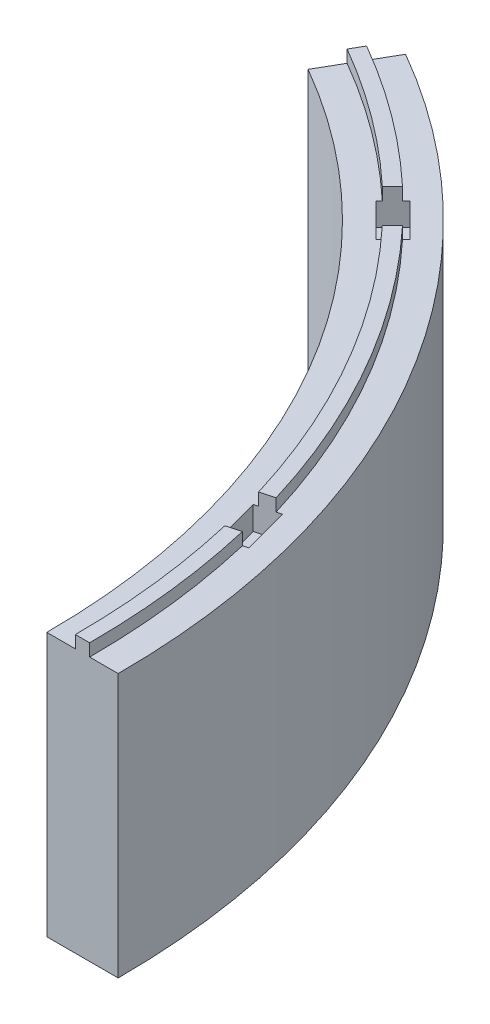
ISO-10303-21;
HEADER;
FILE_DESCRIPTION(('STEP AP214'),'2;1');
FILE_NAME('part.step','',(''),(''),'','','');
FILE_SCHEMA(('AUTOMOTIVE_DESIGN { 1 0 10303 214 1 1 1 1 }'));
ENDSEC;
DATA;
#1=APPLICATION_CONTEXT('core data for automotive mechanical design processes');
#2=APPLICATION_PROTOCOL_DEFINITION('international standard','automotive_design',2000,#1);
#3=PRODUCT_CONTEXT('',#1,'mechanical');
#4=PRODUCT('Part','Part','',(#3));
#5=PRODUCT_RELATED_PRODUCT_CATEGORY('part','',(#4));
#6=PRODUCT_DEFINITION_FORMATION('','',#4);
#7=PRODUCT_DEFINITION_CONTEXT('part definition',#1,'design');
#8=PRODUCT_DEFINITION('design','',#6,#7);
#9=PRODUCT_DEFINITION_SHAPE('','',#8);
#10=(LENGTH_UNIT() NAMED_UNIT(*) SI_UNIT(.MILLI.,.METRE.));
#11=(NAMED_UNIT(*) PLANE_ANGLE_UNIT() SI_UNIT($,.RADIAN.));
#12=(NAMED_UNIT(*) SI_UNIT($,.STERADIAN.) SOLID_ANGLE_UNIT());
#13=UNCERTAINTY_MEASURE_WITH_UNIT(LENGTH_MEASURE(1.E-05),#10,'distance_accuracy_value','');
#14=(GEOMETRIC_REPRESENTATION_CONTEXT(3) GLOBAL_UNCERTAINTY_ASSIGNED_CONTEXT((#13)) GLOBAL_UNIT_ASSIGNED_CONTEXT((#10,
#11,#12)) REPRESENTATION_CONTEXT('',''));
#15=CARTESIAN_POINT('',(0.,0.,0.));
#16=DIRECTION('',(0.,0.,1.));
#17=DIRECTION('',(1.,0.,0.));
#18=AXIS2_PLACEMENT_3D('',#15,#16,#17);
#19=CARTESIAN_POINT('',(0.,58.,0.));
#20=DIRECTION('',(0.,-1.,0.));
#21=DIRECTION('',(0.,0.,-1.));
#22=AXIS2_PLACEMENT_3D('',#19,#20,#21);
#23=CYLINDRICAL_SURFACE('',#22,159.);
#24=CARTESIAN_POINT('',(0.,58.,0.));
#25=DIRECTION('',(0.,1.,0.));
#26=DIRECTION('',(0.,0.,1.));
#27=AXIS2_PLACEMENT_3D('',#24,#25,#26);
#28=CIRCLE('',#27,159.);
#29=CARTESIAN_POINT('',(152.212154806823,58.,-45.9615048607398));
#30=VERTEX_POINT('',#29);
#31=CARTESIAN_POINT('',(115.909908208974,58.,-108.838840397109));
#32=VERTEX_POINT('',#31);
#33=EDGE_CURVE('E308',#30,#32,#28,.T.);
#34=ORIENTED_EDGE('',*,*,#33,.F.);
#35=DIRECTION('',(0.,-1.,0.));
#36=VECTOR('',#35,1.);
#37=CARTESIAN_POINT('',(152.212154806823,58.,-45.9615048607398));
#38=LINE('',#37,#36);
#39=CARTESIAN_POINT('',(152.212154806823,55.4,-45.9615048607398));
#40=VERTEX_POINT('',#39);
#41=EDGE_CURVE('E297',#30,#40,#38,.T.);
#42=ORIENTED_EDGE('',*,*,#41,.T.);
#43=CARTESIAN_POINT('',(0.,55.4,0.));
#44=DIRECTION('',(0.,1.,0.));
#45=DIRECTION('',(0.,0.,1.));
#46=AXIS2_PLACEMENT_3D('',#43,#44,#45);
#47=CIRCLE('',#46,159.);
#48=CARTESIAN_POINT('',(115.909908208974,55.4,-108.838840397109));
#49=VERTEX_POINT('',#48);
#50=EDGE_CURVE('E323',#40,#49,#47,.T.);
#51=ORIENTED_EDGE('',*,*,#50,.T.);
#52=DIRECTION('',(0.,-1.,0.));
#53=VECTOR('',#52,1.);
#54=CARTESIAN_POINT('',(115.909908208974,58.,-108.838840397109));
#55=LINE('',#54,#53);
#56=EDGE_CURVE('E264',#49,#32,#55,.F.);
#57=ORIENTED_EDGE('',*,*,#56,.T.);
#58=EDGE_LOOP('',(#34,#42,#51,#57));
#59=FACE_BOUND('',#58,.T.);
#60=ADVANCED_FACE('F37',(#59),#23,.T.);
#61=CARTESIAN_POINT('',(108.838840397108,58.,-115.909908208974));
#62=VERTEX_POINT('',#61);
#63=CARTESIAN_POINT('',(79.4999999999996,58.,-137.698039201726));
#64=VERTEX_POINT('',#63);
#65=EDGE_CURVE('E309',#62,#64,#28,.T.);
#66=ORIENTED_EDGE('',*,*,#65,.F.);
#67=DIRECTION('',(0.,-1.,0.));
#68=VECTOR('',#67,1.);
#69=CARTESIAN_POINT('',(108.838840397108,58.,-115.909908208974));
#70=LINE('',#69,#68);
#71=CARTESIAN_POINT('',(108.838840397108,55.4,-115.909908208974));
#72=VERTEX_POINT('',#71);
#73=EDGE_CURVE('E276',#62,#72,#70,.T.);
#74=ORIENTED_EDGE('',*,*,#73,.T.);
#75=CARTESIAN_POINT('',(79.4999999999996,55.4,-137.698039201726));
#76=VERTEX_POINT('',#75);
#77=EDGE_CURVE('E303',#72,#76,#47,.T.);
#78=ORIENTED_EDGE('',*,*,#77,.T.);
#79=DIRECTION('',(0.,-1.,0.));
#80=VECTOR('',#79,1.);
#81=CARTESIAN_POINT('',(79.4999999999996,58.,-137.698039201726));
#82=LINE('',#81,#80);
#83=EDGE_CURVE('E336',#64,#76,#82,.T.);
#84=ORIENTED_EDGE('',*,*,#83,.F.);
#85=EDGE_LOOP('',(#66,#74,#78,#84));
#86=FACE_BOUND('',#85,.T.);
#87=ADVANCED_FACE('F421',(#86),#23,.T.);
#88=CARTESIAN_POINT('',(0.,58.,0.));
#89=DIRECTION('',(0.,-1.,0.));
#90=DIRECTION('',(0.,0.,-1.));
#91=AXIS2_PLACEMENT_3D('',#88,#89,#90);
#92=CYLINDRICAL_SURFACE('',#91,156.);
#93=CARTESIAN_POINT('',(0.,55.4,0.));
#94=DIRECTION('',(0.,-1.,0.));
#95=DIRECTION('',(0.,0.,1.));
#96=AXIS2_PLACEMENT_3D('',#93,#94,#95);
#97=CIRCLE('',#96,156.);
#98=CARTESIAN_POINT('',(113.787518015063,55.4,-106.716450203198));
#99=VERTEX_POINT('',#98);
#100=CARTESIAN_POINT('',(149.312915885198,55.4,-45.1846561330255));
#101=VERTEX_POINT('',#100);
#102=EDGE_CURVE('E327',#99,#101,#97,.T.);
#103=ORIENTED_EDGE('',*,*,#102,.T.);
#104=DIRECTION('',(0.,-1.,0.));
#105=VECTOR('',#104,1.);
#106=CARTESIAN_POINT('',(149.312915885198,58.,-45.1846561330255));
#107=LINE('',#106,#105);
#108=CARTESIAN_POINT('',(149.312915885198,58.,-45.1846561330255));
#109=VERTEX_POINT('',#108);
#110=EDGE_CURVE('E291',#101,#109,#107,.F.);
#111=ORIENTED_EDGE('',*,*,#110,.T.);
#112=CARTESIAN_POINT('',(0.,58.,0.));
#113=DIRECTION('',(0.,-1.,0.));
#114=DIRECTION('',(0.,0.,1.));
#115=AXIS2_PLACEMENT_3D('',#112,#113,#114);
#116=CIRCLE('',#115,156.);
#117=CARTESIAN_POINT('',(113.787518015063,58.,-106.716450203198));
#118=VERTEX_POINT('',#117);
#119=EDGE_CURVE('E316',#118,#109,#116,.T.);
#120=ORIENTED_EDGE('',*,*,#119,.F.);
#121=DIRECTION('',(0.,-1.,0.));
#122=VECTOR('',#121,1.);
#123=CARTESIAN_POINT('',(113.787518015063,58.,-106.716450203198));
#124=LINE('',#123,#122);
#125=EDGE_CURVE('E60',#118,#99,#124,.T.);
#126=ORIENTED_EDGE('',*,*,#125,.T.);
#127=EDGE_LOOP('',(#103,#111,#120,#126));
#128=FACE_BOUND('',#127,.T.);
#129=ADVANCED_FACE('F466',(#128),#92,.F.);
#130=CARTESIAN_POINT('',(77.9999999999996,55.4,-135.099962990373));
#131=VERTEX_POINT('',#130);
#132=CARTESIAN_POINT('',(106.716450203198,55.4,-113.787518015064));
#133=VERTEX_POINT('',#132);
#134=EDGE_CURVE('E324',#131,#133,#97,.T.);
#135=ORIENTED_EDGE('',*,*,#134,.T.);
#136=DIRECTION('',(0.,-1.,0.));
#137=VECTOR('',#136,1.);
#138=CARTESIAN_POINT('',(106.716450203198,58.,-113.787518015064));
#139=LINE('',#138,#137);
#140=CARTESIAN_POINT('',(106.716450203198,58.,-113.787518015064));
#141=VERTEX_POINT('',#140);
#142=EDGE_CURVE('E270',#133,#141,#139,.F.);
#143=ORIENTED_EDGE('',*,*,#142,.T.);
#144=CARTESIAN_POINT('',(77.9999999999996,58.,-135.099962990373));
#145=VERTEX_POINT('',#144);
#146=EDGE_CURVE('E312',#145,#141,#116,.T.);
#147=ORIENTED_EDGE('',*,*,#146,.F.);
#148=DIRECTION('',(0.,-1.,0.));
#149=VECTOR('',#148,1.);
#150=CARTESIAN_POINT('',(77.9999999999996,58.,-135.099962990373));
#151=LINE('',#150,#149);
#152=EDGE_CURVE('E333',#145,#131,#151,.T.);
#153=ORIENTED_EDGE('',*,*,#152,.T.);
#154=EDGE_LOOP('',(#135,#143,#147,#153));
#155=FACE_BOUND('',#154,.T.);
#156=ADVANCED_FACE('F445',(#155),#92,.F.);
#157=CARTESIAN_POINT('',(0.,58.,0.));
#158=DIRECTION('',(0.,1.,0.));
#159=DIRECTION('',(0.,0.,1.));
#160=AXIS2_PLACEMENT_3D('',#157,#158,#159);
#161=PLANE('',#160);
#162=DIRECTION('',(-0.965925826289068,0.,0.258819045102521));
#163=VECTOR('',#162,1.);
#164=CARTESIAN_POINT('',(-1.29409522551262,58.,-4.82962913144537));
#165=LINE('',#164,#163);
#166=EDGE_CURVE('E379',#30,#109,#165,.T.);
#167=ORIENTED_EDGE('',*,*,#166,.F.);
#168=ORIENTED_EDGE('',*,*,#33,.T.);
#169=DIRECTION('',(0.707106781186546,0.,-0.707106781186549));
#170=VECTOR('',#169,1.);
#171=CARTESIAN_POINT('',(3.53553390593273,58.,3.53553390593271));
#172=LINE('',#171,#170);
#173=EDGE_CURVE('E373',#118,#32,#172,.T.);
#174=ORIENTED_EDGE('',*,*,#173,.F.);
#175=ORIENTED_EDGE('',*,*,#119,.T.);
#176=EDGE_LOOP('',(#167,#168,#174,#175));
#177=FACE_BOUND('',#176,.T.);
#178=ADVANCED_FACE('F406',(#177),#161,.T.);
#179=DIRECTION('',(-0.707106781186545,0.,0.70710678118655));
#180=VECTOR('',#179,1.);
#181=CARTESIAN_POINT('',(-3.53553390593256,58.,-3.53553390593253));
#182=LINE('',#181,#180);
#183=EDGE_CURVE('E375',#62,#141,#182,.T.);
#184=ORIENTED_EDGE('',*,*,#183,.F.);
#185=ORIENTED_EDGE('',*,*,#65,.T.);
#186=DIRECTION('',(-0.499999999999998,0.,0.866025403784439));
#187=VECTOR('',#186,1.);
#188=CARTESIAN_POINT('',(77.9999999999996,58.,-135.099962990373));
#189=LINE('',#188,#187);
#190=EDGE_CURVE('E307',#64,#145,#189,.T.);
#191=ORIENTED_EDGE('',*,*,#190,.T.);
#192=ORIENTED_EDGE('',*,*,#146,.T.);
#193=EDGE_LOOP('',(#184,#185,#191,#192));
#194=FACE_BOUND('',#193,.T.);
#195=ADVANCED_FACE('F413',(#194),#161,.T.);
#196=CARTESIAN_POINT('',(0.,55.4,0.));
#197=DIRECTION('',(0.,-1.,0.));
#198=DIRECTION('',(0.,0.,-1.));
#199=AXIS2_PLACEMENT_3D('',#196,#197,#198);
#200=PLANE('',#199);
#201=ORIENTED_EDGE('',*,*,#50,.F.);
#202=DIRECTION('',(0.965925826289068,0.,-0.258819045102521));
#203=VECTOR('',#202,1.);
#204=CARTESIAN_POINT('',(-1.29409522551262,55.4,-4.82962913144537));
#205=LINE('',#204,#203);
#206=CARTESIAN_POINT('',(153.254036980738,55.4,-46.2406763478488));
#207=VERTEX_POINT('',#206);
#208=EDGE_CURVE('E300',#40,#207,#205,.T.);
#209=ORIENTED_EDGE('',*,*,#208,.T.);
#210=DIRECTION('',(0.258819045102521,0.,0.965925826289068));
#211=VECTOR('',#210,1.);
#212=CARTESIAN_POINT('',(154.548132206251,55.4,-41.4110472164033));
#213=LINE('',#212,#211);
#214=CARTESIAN_POINT('',(155.842227431763,55.4,-36.5814180849581));
#215=VERTEX_POINT('',#214);
#216=EDGE_CURVE('E11',#207,#215,#213,.T.);
#217=ORIENTED_EDGE('',*,*,#216,.T.);
#218=DIRECTION('',(-0.965925826289068,0.,0.258819045102521));
#219=VECTOR('',#218,1.);
#220=CARTESIAN_POINT('',(1.2940952255126,55.4,4.82962913144532));
#221=LINE('',#220,#219);
#222=CARTESIAN_POINT('',(154.800345257848,55.4,-36.3022465978491));
#223=VERTEX_POINT('',#222);
#224=EDGE_CURVE('E288',#215,#223,#221,.T.);
#225=ORIENTED_EDGE('',*,*,#224,.T.);
#226=CARTESIAN_POINT('',(159.,55.4,0.));
#227=VERTEX_POINT('',#226);
#228=EDGE_CURVE('E319',#227,#223,#47,.T.);
#229=ORIENTED_EDGE('',*,*,#228,.F.);
#230=DIRECTION('',(1.,0.,0.));
#231=VECTOR('',#230,1.);
#232=CARTESIAN_POINT('',(150.,55.4,0.));
#233=LINE('',#232,#231);
#234=CARTESIAN_POINT('',(165.,55.4,0.));
#235=VERTEX_POINT('',#234);
#236=EDGE_CURVE('E350',#227,#235,#233,.T.);
#237=ORIENTED_EDGE('',*,*,#236,.T.);
#238=CARTESIAN_POINT('',(0.,55.4,0.));
#239=DIRECTION('',(0.,1.,0.));
#240=DIRECTION('',(0.,0.,-1.));
#241=AXIS2_PLACEMENT_3D('',#238,#239,#240);
#242=CIRCLE('',#241,165.);
#243=CARTESIAN_POINT('',(82.4999999999996,55.4,-142.894191624433));
#244=VERTEX_POINT('',#243);
#245=EDGE_CURVE('E340',#235,#244,#242,.T.);
#246=ORIENTED_EDGE('',*,*,#245,.T.);
#247=DIRECTION('',(-0.499999999999998,0.,0.86602540378444));
#248=VECTOR('',#247,1.);
#249=CARTESIAN_POINT('',(74.9999999999997,55.4,-129.903810567666));
#250=LINE('',#249,#248);
#251=EDGE_CURVE('E345',#244,#76,#250,.T.);
#252=ORIENTED_EDGE('',*,*,#251,.T.);
#253=ORIENTED_EDGE('',*,*,#77,.F.);
#254=DIRECTION('',(0.707106781186545,0.,-0.70710678118655));
#255=VECTOR('',#254,1.);
#256=CARTESIAN_POINT('',(-3.53553390593256,55.4,-3.53553390593253));
#257=LINE('',#256,#255);
#258=CARTESIAN_POINT('',(109.601551083915,55.4,-116.672618895781));
#259=VERTEX_POINT('',#258);
#260=EDGE_CURVE('E279',#72,#259,#257,.T.);
#261=ORIENTED_EDGE('',*,*,#260,.T.);
#262=DIRECTION('',(0.70710678118655,0.,0.707106781186545));
#263=VECTOR('',#262,1.);
#264=CARTESIAN_POINT('',(113.137084989847,55.4,-113.137084989848));
#265=LINE('',#264,#263);
#266=CARTESIAN_POINT('',(116.67261889578,55.4,-109.601551083915));
#267=VERTEX_POINT('',#266);
#268=EDGE_CURVE('E45',#259,#267,#265,.T.);
#269=ORIENTED_EDGE('',*,*,#268,.T.);
#270=DIRECTION('',(-0.707106781186546,0.,0.707106781186549));
#271=VECTOR('',#270,1.);
#272=CARTESIAN_POINT('',(3.53553390593273,55.4,3.53553390593271));
#273=LINE('',#272,#271);
#274=EDGE_CURVE('E267',#267,#49,#273,.T.);
#275=ORIENTED_EDGE('',*,*,#274,.T.);
#276=EDGE_LOOP('',(#201,#209,#217,#225,#229,#237,#246,#252,#253,#261,#269,#275));
#277=FACE_BOUND('',#276,.T.);
#278=ADVANCED_FACE('F387',(#277),#200,.F.);
#279=DIRECTION('',(-0.258819045102521,0.,-0.965925826289068));
#280=VECTOR('',#279,1.);
#281=CARTESIAN_POINT('',(149.718503074806,55.4,-40.1169519908907));
#282=LINE('',#281,#280);
#283=CARTESIAN_POINT('',(151.012598300318,55.4,-35.2873228594455));
#284=VERTEX_POINT('',#283);
#285=CARTESIAN_POINT('',(148.424407849293,55.4,-44.9465811223362));
#286=VERTEX_POINT('',#285);
#287=EDGE_CURVE('E206',#284,#286,#282,.T.);
#288=ORIENTED_EDGE('',*,*,#287,.T.);
#289=DIRECTION('',(0.965925826289068,0.,-0.258819045102521));
#290=VECTOR('',#289,1.);
#291=CARTESIAN_POINT('',(-1.29409522551262,55.4,-4.82962913144537));
#292=LINE('',#291,#290);
#293=EDGE_CURVE('E294',#286,#101,#292,.T.);
#294=ORIENTED_EDGE('',*,*,#293,.T.);
#295=ORIENTED_EDGE('',*,*,#102,.F.);
#296=DIRECTION('',(-0.707106781186546,0.,0.707106781186549));
#297=VECTOR('',#296,1.);
#298=CARTESIAN_POINT('',(3.53553390593273,55.4,3.53553390593271));
#299=LINE('',#298,#297);
#300=CARTESIAN_POINT('',(113.137084989847,55.4,-106.066017177982));
#301=VERTEX_POINT('',#300);
#302=EDGE_CURVE('E261',#99,#301,#299,.T.);
#303=ORIENTED_EDGE('',*,*,#302,.T.);
#304=DIRECTION('',(-0.707106781186549,0.,-0.707106781186546));
#305=VECTOR('',#304,1.);
#306=CARTESIAN_POINT('',(109.601551083915,55.4,-109.601551083915));
#307=LINE('',#306,#305);
#308=CARTESIAN_POINT('',(106.066017177982,55.4,-113.137084989848));
#309=VERTEX_POINT('',#308);
#310=EDGE_CURVE('E381',#301,#309,#307,.T.);
#311=ORIENTED_EDGE('',*,*,#310,.T.);
#312=DIRECTION('',(0.707106781186545,0.,-0.70710678118655));
#313=VECTOR('',#312,1.);
#314=CARTESIAN_POINT('',(-3.53553390593256,55.4,-3.53553390593253));
#315=LINE('',#314,#313);
#316=EDGE_CURVE('E273',#309,#133,#315,.T.);
#317=ORIENTED_EDGE('',*,*,#316,.T.);
#318=ORIENTED_EDGE('',*,*,#134,.F.);
#319=CARTESIAN_POINT('',(74.9999999999997,55.4,-129.903810567666));
#320=VERTEX_POINT('',#319);
#321=EDGE_CURVE('E343',#131,#320,#250,.T.);
#322=ORIENTED_EDGE('',*,*,#321,.T.);
#323=CARTESIAN_POINT('',(0.,55.4,0.));
#324=DIRECTION('',(0.,-1.,0.));
#325=DIRECTION('',(0.,0.,-1.));
#326=AXIS2_PLACEMENT_3D('',#323,#324,#325);
#327=CIRCLE('',#326,150.);
#328=CARTESIAN_POINT('',(150.,55.4,0.));
#329=VERTEX_POINT('',#328);
#330=EDGE_CURVE('E348',#320,#329,#327,.T.);
#331=ORIENTED_EDGE('',*,*,#330,.T.);
#332=CARTESIAN_POINT('',(156.,55.4,0.));
#333=VERTEX_POINT('',#332);
#334=EDGE_CURVE('E351',#329,#333,#233,.T.);
#335=ORIENTED_EDGE('',*,*,#334,.T.);
#336=CARTESIAN_POINT('',(151.901106336223,55.4,-35.5253978701348));
#337=VERTEX_POINT('',#336);
#338=EDGE_CURVE('E322',#337,#333,#97,.T.);
#339=ORIENTED_EDGE('',*,*,#338,.F.);
#340=DIRECTION('',(-0.965925826289068,0.,0.258819045102521));
#341=VECTOR('',#340,1.);
#342=CARTESIAN_POINT('',(1.2940952255126,55.4,4.82962913144532));
#343=LINE('',#342,#341);
#344=EDGE_CURVE('E283',#337,#284,#343,.T.);
#345=ORIENTED_EDGE('',*,*,#344,.T.);
#346=EDGE_LOOP('',(#288,#294,#295,#303,#311,#317,#318,#322,#331,#335,#339,#345));
#347=FACE_BOUND('',#346,.T.);
#348=ADVANCED_FACE('F443',(#347),#200,.F.);
#349=CARTESIAN_POINT('',(0.,55.4,0.));
#350=DIRECTION('',(0.,-1.,0.));
#351=DIRECTION('',(0.,0.,-1.));
#352=AXIS2_PLACEMENT_3D('',#349,#350,#351);
#353=CYLINDRICAL_SURFACE('',#352,165.);
#354=CARTESIAN_POINT('',(0.,0.,0.));
#355=DIRECTION('',(0.,1.,0.));
#356=DIRECTION('',(0.,0.,-1.));
#357=AXIS2_PLACEMENT_3D('',#354,#355,#356);
#358=CIRCLE('',#357,165.);
#359=CARTESIAN_POINT('',(165.,0.,0.));
#360=VERTEX_POINT('',#359);
#361=CARTESIAN_POINT('',(82.4999999999996,0.,-142.894191624433));
#362=VERTEX_POINT('',#361);
#363=EDGE_CURVE('E339',#360,#362,#358,.T.);
#364=ORIENTED_EDGE('',*,*,#363,.T.);
#365=DIRECTION('',(0.,-1.,0.));
#366=VECTOR('',#365,1.);
#367=CARTESIAN_POINT('',(82.4999999999996,55.4,-142.894191624433));
#368=LINE('',#367,#366);
#369=EDGE_CURVE('E370',#244,#362,#368,.T.);
#370=ORIENTED_EDGE('',*,*,#369,.F.);
#371=ORIENTED_EDGE('',*,*,#245,.F.);
#372=DIRECTION('',(0.,-1.,0.));
#373=VECTOR('',#372,1.);
#374=CARTESIAN_POINT('',(165.,55.4,0.));
#375=LINE('',#374,#373);
#376=EDGE_CURVE('E354',#235,#360,#375,.T.);
#377=ORIENTED_EDGE('',*,*,#376,.T.);
#378=EDGE_LOOP('',(#364,#370,#371,#377));
#379=FACE_BOUND('',#378,.T.);
#380=ADVANCED_FACE('F39',(#379),#353,.T.);
#381=CARTESIAN_POINT('',(74.9999999999997,55.4,-129.903810567666));
#382=DIRECTION('',(0.86602540378444,0.,0.499999999999998));
#383=DIRECTION('',(0.499999999999998,0.,-0.86602540378444));
#384=AXIS2_PLACEMENT_3D('',#381,#382,#383);
#385=PLANE('',#384);
#386=DIRECTION('',(-0.499999999999998,0.,0.86602540378444));
#387=VECTOR('',#386,1.);
#388=CARTESIAN_POINT('',(74.9999999999997,0.,-129.903810567666));
#389=LINE('',#388,#387);
#390=CARTESIAN_POINT('',(74.9999999999997,0.,-129.903810567666));
#391=VERTEX_POINT('',#390);
#392=EDGE_CURVE('E357',#362,#391,#389,.T.);
#393=ORIENTED_EDGE('',*,*,#392,.T.);
#394=DIRECTION('',(0.,-1.,0.));
#395=VECTOR('',#394,1.);
#396=CARTESIAN_POINT('',(74.9999999999997,55.4,-129.903810567666));
#397=LINE('',#396,#395);
#398=EDGE_CURVE('E367',#320,#391,#397,.T.);
#399=ORIENTED_EDGE('',*,*,#398,.F.);
#400=ORIENTED_EDGE('',*,*,#321,.F.);
#401=ORIENTED_EDGE('',*,*,#152,.F.);
#402=ORIENTED_EDGE('',*,*,#190,.F.);
#403=ORIENTED_EDGE('',*,*,#83,.T.);
#404=ORIENTED_EDGE('',*,*,#251,.F.);
#405=ORIENTED_EDGE('',*,*,#369,.T.);
#406=EDGE_LOOP('',(#393,#399,#400,#401,#402,#403,#404,#405));
#407=FACE_BOUND('',#406,.T.);
#408=ADVANCED_FACE('F418',(#407),#385,.F.);
#409=CARTESIAN_POINT('',(0.,55.4,0.));
#410=DIRECTION('',(0.,-1.,0.));
#411=DIRECTION('',(0.,0.,-1.));
#412=AXIS2_PLACEMENT_3D('',#409,#410,#411);
#413=CYLINDRICAL_SURFACE('',#412,150.);
#414=CARTESIAN_POINT('',(0.,0.,0.));
#415=DIRECTION('',(0.,-1.,0.));
#416=DIRECTION('',(0.,0.,-1.));
#417=AXIS2_PLACEMENT_3D('',#414,#415,#416);
#418=CIRCLE('',#417,150.);
#419=CARTESIAN_POINT('',(150.,0.,0.));
#420=VERTEX_POINT('',#419);
#421=EDGE_CURVE('E359',#391,#420,#418,.T.);
#422=ORIENTED_EDGE('',*,*,#421,.T.);
#423=DIRECTION('',(0.,-1.,0.));
#424=VECTOR('',#423,1.);
#425=CARTESIAN_POINT('',(150.,55.4,0.));
#426=LINE('',#425,#424);
#427=EDGE_CURVE('E364',#329,#420,#426,.T.);
#428=ORIENTED_EDGE('',*,*,#427,.F.);
#429=ORIENTED_EDGE('',*,*,#330,.F.);
#430=ORIENTED_EDGE('',*,*,#398,.T.);
#431=EDGE_LOOP('',(#422,#428,#429,#430));
#432=FACE_BOUND('',#431,.T.);
#433=ADVANCED_FACE('F434',(#432),#413,.F.);
#434=CARTESIAN_POINT('',(150.,55.4,0.));
#435=DIRECTION('',(0.,0.,-1.));
#436=DIRECTION('',(-1.,0.,0.));
#437=AXIS2_PLACEMENT_3D('',#434,#435,#436);
#438=PLANE('',#437);
#439=DIRECTION('',(1.,0.,0.));
#440=VECTOR('',#439,1.);
#441=CARTESIAN_POINT('',(150.,0.,0.));
#442=LINE('',#441,#440);
#443=EDGE_CURVE('E344',#420,#360,#442,.T.);
#444=ORIENTED_EDGE('',*,*,#443,.T.);
#445=ORIENTED_EDGE('',*,*,#376,.F.);
#446=ORIENTED_EDGE('',*,*,#236,.F.);
#447=DIRECTION('',(0.,-1.,0.));
#448=VECTOR('',#447,1.);
#449=CARTESIAN_POINT('',(159.,58.,0.));
#450=LINE('',#449,#448);
#451=CARTESIAN_POINT('',(159.,58.,0.));
#452=VERTEX_POINT('',#451);
#453=EDGE_CURVE('E318',#452,#227,#450,.T.);
#454=ORIENTED_EDGE('',*,*,#453,.F.);
#455=DIRECTION('',(1.,0.,0.));
#456=VECTOR('',#455,1.);
#457=CARTESIAN_POINT('',(156.,58.,0.));
#458=LINE('',#457,#456);
#459=CARTESIAN_POINT('',(156.,58.,0.));
#460=VERTEX_POINT('',#459);
#461=EDGE_CURVE('E315',#460,#452,#458,.T.);
#462=ORIENTED_EDGE('',*,*,#461,.F.);
#463=DIRECTION('',(0.,-1.,0.));
#464=VECTOR('',#463,1.);
#465=CARTESIAN_POINT('',(156.,58.,0.));
#466=LINE('',#465,#464);
#467=EDGE_CURVE('E330',#460,#333,#466,.T.);
#468=ORIENTED_EDGE('',*,*,#467,.T.);
#469=ORIENTED_EDGE('',*,*,#334,.F.);
#470=ORIENTED_EDGE('',*,*,#427,.T.);
#471=EDGE_LOOP('',(#444,#445,#446,#454,#462,#468,#469,#470));
#472=FACE_BOUND('',#471,.T.);
#473=ADVANCED_FACE('F438',(#472),#438,.F.);
#474=CARTESIAN_POINT('',(0.,0.,0.));
#475=DIRECTION('',(0.,-1.,0.));
#476=DIRECTION('',(0.,0.,-1.));
#477=AXIS2_PLACEMENT_3D('',#474,#475,#476);
#478=PLANE('',#477);
#479=CARTESIAN_POINT('',(111.369318036881,0.,-111.369318036881));
#480=DIRECTION('',(0.,-1.,0.));
#481=DIRECTION('',(0.,0.,-1.));
#482=AXIS2_PLACEMENT_3D('',#479,#480,#481);
#483=CIRCLE('',#482,2.2);
#484=CARTESIAN_POINT('',(111.369318036881,0.,-113.569318036881));
#485=VERTEX_POINT('',#484);
#486=EDGE_CURVE('E758',#485,#485,#483,.T.);
#487=ORIENTED_EDGE('',*,*,#486,.F.);
#488=EDGE_LOOP('',(#487));
#489=FACE_BOUND('',#488,.T.);
#490=CARTESIAN_POINT('',(152.133317640528,0.,-40.7639996036471));
#491=DIRECTION('',(0.,-1.,0.));
#492=DIRECTION('',(0.,0.,-1.));
#493=AXIS2_PLACEMENT_3D('',#490,#491,#492);
#494=CIRCLE('',#493,2.20000000000001);
#495=CARTESIAN_POINT('',(152.133317640528,0.,-42.9639996036471));
#496=VERTEX_POINT('',#495);
#497=EDGE_CURVE('E761',#496,#496,#494,.T.);
#498=ORIENTED_EDGE('',*,*,#497,.F.);
#499=EDGE_LOOP('',(#498));
#500=FACE_BOUND('',#499,.T.);
#501=ORIENTED_EDGE('',*,*,#363,.F.);
#502=ORIENTED_EDGE('',*,*,#443,.F.);
#503=ORIENTED_EDGE('',*,*,#421,.F.);
#504=ORIENTED_EDGE('',*,*,#392,.F.);
#505=EDGE_LOOP('',(#501,#502,#503,#504));
#506=FACE_BOUND('',#505,.T.);
#507=ADVANCED_FACE('F430',(#489,#500,#506),#478,.T.);
#508=ORIENTED_EDGE('',*,*,#228,.T.);
#509=DIRECTION('',(0.,-1.,0.));
#510=VECTOR('',#509,1.);
#511=CARTESIAN_POINT('',(154.800345257848,58.,-36.3022465978491));
#512=LINE('',#511,#510);
#513=CARTESIAN_POINT('',(154.800345257848,58.,-36.3022465978491));
#514=VERTEX_POINT('',#513);
#515=EDGE_CURVE('E285',#223,#514,#512,.F.);
#516=ORIENTED_EDGE('',*,*,#515,.T.);
#517=EDGE_CURVE('E304',#452,#514,#28,.T.);
#518=ORIENTED_EDGE('',*,*,#517,.F.);
#519=ORIENTED_EDGE('',*,*,#453,.T.);
#520=EDGE_LOOP('',(#508,#516,#518,#519));
#521=FACE_BOUND('',#520,.T.);
#522=ADVANCED_FACE('F462',(#521),#23,.T.);
#523=CARTESIAN_POINT('',(151.901106336223,58.,-35.5253978701348));
#524=VERTEX_POINT('',#523);
#525=EDGE_CURVE('E311',#524,#460,#116,.T.);
#526=ORIENTED_EDGE('',*,*,#525,.F.);
#527=DIRECTION('',(0.,-1.,0.));
#528=VECTOR('',#527,1.);
#529=CARTESIAN_POINT('',(151.901106336223,58.,-35.5253978701348));
#530=LINE('',#529,#528);
#531=EDGE_CURVE('E52',#524,#337,#530,.T.);
#532=ORIENTED_EDGE('',*,*,#531,.T.);
#533=ORIENTED_EDGE('',*,*,#338,.T.);
#534=ORIENTED_EDGE('',*,*,#467,.F.);
#535=EDGE_LOOP('',(#526,#532,#533,#534));
#536=FACE_BOUND('',#535,.T.);
#537=ADVANCED_FACE('F470',(#536),#92,.F.);
#538=DIRECTION('',(0.965925826289068,0.,-0.258819045102521));
#539=VECTOR('',#538,1.);
#540=CARTESIAN_POINT('',(1.2940952255126,58.,4.82962913144532));
#541=LINE('',#540,#539);
#542=EDGE_CURVE('E377',#524,#514,#541,.T.);
#543=ORIENTED_EDGE('',*,*,#542,.F.);
#544=ORIENTED_EDGE('',*,*,#525,.T.);
#545=ORIENTED_EDGE('',*,*,#461,.T.);
#546=ORIENTED_EDGE('',*,*,#517,.T.);
#547=EDGE_LOOP('',(#543,#544,#545,#546));
#548=FACE_BOUND('',#547,.T.);
#549=ADVANCED_FACE('F456',(#548),#161,.T.);
#550=CARTESIAN_POINT('',(109.601551083915,50.5,-116.672618895781));
#551=DIRECTION('',(0.707106781186545,0.,-0.70710678118655));
#552=DIRECTION('',(-0.70710678118655,0.,-0.707106781186545));
#553=AXIS2_PLACEMENT_3D('',#550,#551,#552);
#554=PLANE('',#553);
#555=DIRECTION('',(0.,1.,0.));
#556=VECTOR('',#555,1.);
#557=CARTESIAN_POINT('',(109.601551083915,50.5,-116.672618895781));
#558=LINE('',#557,#556);
#559=CARTESIAN_POINT('',(109.601551083915,50.5,-116.672618895781));
#560=VERTEX_POINT('',#559);
#561=EDGE_CURVE('E246',#560,#259,#558,.T.);
#562=ORIENTED_EDGE('',*,*,#561,.F.);
#563=DIRECTION('',(-0.70710678118655,0.,-0.707106781186545));
#564=VECTOR('',#563,1.);
#565=CARTESIAN_POINT('',(109.601551083915,50.5,-116.672618895781));
#566=LINE('',#565,#564);
#567=CARTESIAN_POINT('',(116.67261889578,50.5,-109.601551083915));
#568=VERTEX_POINT('',#567);
#569=EDGE_CURVE('E255',#568,#560,#566,.T.);
#570=ORIENTED_EDGE('',*,*,#569,.F.);
#571=DIRECTION('',(0.,1.,0.));
#572=VECTOR('',#571,1.);
#573=CARTESIAN_POINT('',(116.67261889578,50.5,-109.601551083915));
#574=LINE('',#573,#572);
#575=EDGE_CURVE('E243',#568,#267,#574,.T.);
#576=ORIENTED_EDGE('',*,*,#575,.T.);
#577=ORIENTED_EDGE('',*,*,#268,.F.);
#578=EDGE_LOOP('',(#562,#570,#576,#577));
#579=FACE_BOUND('',#578,.T.);
#580=ADVANCED_FACE('F391',(#579),#554,.F.);
#581=CARTESIAN_POINT('',(113.137084989847,50.5,-106.066017177982));
#582=DIRECTION('',(-0.707106781186546,0.,0.707106781186549));
#583=DIRECTION('',(0.707106781186549,0.,0.707106781186546));
#584=AXIS2_PLACEMENT_3D('',#581,#582,#583);
#585=PLANE('',#584);
#586=DIRECTION('',(0.,1.,0.));
#587=VECTOR('',#586,1.);
#588=CARTESIAN_POINT('',(113.137084989847,50.5,-106.066017177982));
#589=LINE('',#588,#587);
#590=CARTESIAN_POINT('',(113.137084989847,50.5,-106.066017177982));
#591=VERTEX_POINT('',#590);
#592=EDGE_CURVE('E239',#591,#301,#589,.T.);
#593=ORIENTED_EDGE('',*,*,#592,.F.);
#594=DIRECTION('',(0.707106781186549,0.,0.707106781186546));
#595=VECTOR('',#594,1.);
#596=CARTESIAN_POINT('',(113.137084989847,50.5,-106.066017177982));
#597=LINE('',#596,#595);
#598=CARTESIAN_POINT('',(106.066017177982,50.5,-113.137084989848));
#599=VERTEX_POINT('',#598);
#600=EDGE_CURVE('E222',#599,#591,#597,.T.);
#601=ORIENTED_EDGE('',*,*,#600,.F.);
#602=DIRECTION('',(0.,1.,0.));
#603=VECTOR('',#602,1.);
#604=CARTESIAN_POINT('',(106.066017177982,50.5,-113.137084989848));
#605=LINE('',#604,#603);
#606=EDGE_CURVE('E249',#599,#309,#605,.T.);
#607=ORIENTED_EDGE('',*,*,#606,.T.);
#608=ORIENTED_EDGE('',*,*,#310,.F.);
#609=EDGE_LOOP('',(#593,#601,#607,#608));
#610=FACE_BOUND('',#609,.T.);
#611=ADVANCED_FACE('F448',(#610),#585,.F.);
#612=CARTESIAN_POINT('',(106.066017177982,50.5,-113.137084989848));
#613=DIRECTION('',(-0.70710678118655,0.,-0.707106781186545));
#614=DIRECTION('',(-0.707106781186545,0.,0.70710678118655));
#615=AXIS2_PLACEMENT_3D('',#612,#613,#614);
#616=PLANE('',#615);
#617=ORIENTED_EDGE('',*,*,#73,.F.);
#618=ORIENTED_EDGE('',*,*,#183,.T.);
#619=ORIENTED_EDGE('',*,*,#142,.F.);
#620=ORIENTED_EDGE('',*,*,#316,.F.);
#621=ORIENTED_EDGE('',*,*,#606,.F.);
#622=DIRECTION('',(-0.707106781186545,0.,0.70710678118655));
#623=VECTOR('',#622,1.);
#624=CARTESIAN_POINT('',(106.066017177982,50.5,-113.137084989848));
#625=LINE('',#624,#623);
#626=EDGE_CURVE('E242',#560,#599,#625,.T.);
#627=ORIENTED_EDGE('',*,*,#626,.F.);
#628=ORIENTED_EDGE('',*,*,#561,.T.);
#629=ORIENTED_EDGE('',*,*,#260,.F.);
#630=EDGE_LOOP('',(#617,#618,#619,#620,#621,#627,#628,#629));
#631=FACE_BOUND('',#630,.T.);
#632=ADVANCED_FACE('F395',(#631),#616,.F.);
#633=CARTESIAN_POINT('',(116.67261889578,50.5,-109.601551083915));
#634=DIRECTION('',(0.707106781186549,0.,0.707106781186546));
#635=DIRECTION('',(0.707106781186546,0.,-0.707106781186549));
#636=AXIS2_PLACEMENT_3D('',#633,#634,#635);
#637=PLANE('',#636);
#638=ORIENTED_EDGE('',*,*,#575,.F.);
#639=DIRECTION('',(0.707106781186546,0.,-0.707106781186549));
#640=VECTOR('',#639,1.);
#641=CARTESIAN_POINT('',(116.67261889578,50.5,-109.601551083915));
#642=LINE('',#641,#640);
#643=EDGE_CURVE('E225',#591,#568,#642,.T.);
#644=ORIENTED_EDGE('',*,*,#643,.F.);
#645=ORIENTED_EDGE('',*,*,#592,.T.);
#646=ORIENTED_EDGE('',*,*,#302,.F.);
#647=ORIENTED_EDGE('',*,*,#125,.F.);
#648=ORIENTED_EDGE('',*,*,#173,.T.);
#649=ORIENTED_EDGE('',*,*,#56,.F.);
#650=ORIENTED_EDGE('',*,*,#274,.F.);
#651=EDGE_LOOP('',(#638,#644,#645,#646,#647,#648,#649,#650));
#652=FACE_BOUND('',#651,.T.);
#653=ADVANCED_FACE('F400',(#652),#637,.F.);
#654=CARTESIAN_POINT('',(0.,50.5,0.));
#655=DIRECTION('',(0.,-1.,0.));
#656=DIRECTION('',(0.,0.,-1.));
#657=AXIS2_PLACEMENT_3D('',#654,#655,#656);
#658=PLANE('',#657);
#659=ORIENTED_EDGE('',*,*,#600,.T.);
#660=ORIENTED_EDGE('',*,*,#643,.T.);
#661=ORIENTED_EDGE('',*,*,#569,.T.);
#662=ORIENTED_EDGE('',*,*,#626,.T.);
#663=EDGE_LOOP('',(#659,#660,#661,#662));
#664=FACE_BOUND('',#663,.T.);
#665=ADVANCED_FACE('F398',(#664),#658,.F.);
#666=CARTESIAN_POINT('',(153.254036980738,50.5,-46.2406763478488));
#667=DIRECTION('',(0.965925826289068,0.,-0.258819045102521));
#668=DIRECTION('',(-0.258819045102521,0.,-0.965925826289068));
#669=AXIS2_PLACEMENT_3D('',#666,#667,#668);
#670=PLANE('',#669);
#671=DIRECTION('',(0.,1.,0.));
#672=VECTOR('',#671,1.);
#673=CARTESIAN_POINT('',(153.254036980738,50.5,-46.2406763478488));
#674=LINE('',#673,#672);
#675=CARTESIAN_POINT('',(153.254036980738,50.5,-46.2406763478488));
#676=VERTEX_POINT('',#675);
#677=EDGE_CURVE('E235',#676,#207,#674,.T.);
#678=ORIENTED_EDGE('',*,*,#677,.F.);
#679=DIRECTION('',(-0.258819045102521,0.,-0.965925826289068));
#680=VECTOR('',#679,1.);
#681=CARTESIAN_POINT('',(153.254036980738,50.5,-46.2406763478488));
#682=LINE('',#681,#680);
#683=CARTESIAN_POINT('',(155.842227431763,50.5,-36.5814180849581));
#684=VERTEX_POINT('',#683);
#685=EDGE_CURVE('E218',#684,#676,#682,.T.);
#686=ORIENTED_EDGE('',*,*,#685,.F.);
#687=DIRECTION('',(0.,1.,0.));
#688=VECTOR('',#687,1.);
#689=CARTESIAN_POINT('',(155.842227431763,50.5,-36.5814180849581));
#690=LINE('',#689,#688);
#691=EDGE_CURVE('E208',#684,#215,#690,.T.);
#692=ORIENTED_EDGE('',*,*,#691,.T.);
#693=ORIENTED_EDGE('',*,*,#216,.F.);
#694=EDGE_LOOP('',(#678,#686,#692,#693));
#695=FACE_BOUND('',#694,.T.);
#696=ADVANCED_FACE('F490',(#695),#670,.F.);
#697=CARTESIAN_POINT('',(151.012598300318,50.5,-35.2873228594455));
#698=DIRECTION('',(-0.965925826289068,0.,0.258819045102521));
#699=DIRECTION('',(0.258819045102521,0.,0.965925826289068));
#700=AXIS2_PLACEMENT_3D('',#697,#698,#699);
#701=PLANE('',#700);
#702=DIRECTION('',(0.,1.,0.));
#703=VECTOR('',#702,1.);
#704=CARTESIAN_POINT('',(151.012598300318,50.5,-35.2873228594455));
#705=LINE('',#704,#703);
#706=CARTESIAN_POINT('',(151.012598300318,50.5,-35.2873228594455));
#707=VERTEX_POINT('',#706);
#708=EDGE_CURVE('E198',#707,#284,#705,.T.);
#709=ORIENTED_EDGE('',*,*,#708,.F.);
#710=DIRECTION('',(0.258819045102521,0.,0.965925826289068));
#711=VECTOR('',#710,1.);
#712=CARTESIAN_POINT('',(151.012598300318,50.5,-35.2873228594455));
#713=LINE('',#712,#711);
#714=CARTESIAN_POINT('',(148.424407849293,50.5,-44.9465811223362));
#715=VERTEX_POINT('',#714);
#716=EDGE_CURVE('E203',#715,#707,#713,.T.);
#717=ORIENTED_EDGE('',*,*,#716,.F.);
#718=DIRECTION('',(0.,1.,0.));
#719=VECTOR('',#718,1.);
#720=CARTESIAN_POINT('',(148.424407849293,50.5,-44.9465811223362));
#721=LINE('',#720,#719);
#722=EDGE_CURVE('E233',#715,#286,#721,.T.);
#723=ORIENTED_EDGE('',*,*,#722,.T.);
#724=ORIENTED_EDGE('',*,*,#287,.F.);
#725=EDGE_LOOP('',(#709,#717,#723,#724));
#726=FACE_BOUND('',#725,.T.);
#727=ADVANCED_FACE('F200',(#726),#701,.F.);
#728=CARTESIAN_POINT('',(148.424407849293,50.5,-44.9465811223362));
#729=DIRECTION('',(-0.258819045102521,0.,-0.965925826289068));
#730=DIRECTION('',(-0.965925826289068,0.,0.258819045102521));
#731=AXIS2_PLACEMENT_3D('',#728,#729,#730);
#732=PLANE('',#731);
#733=ORIENTED_EDGE('',*,*,#41,.F.);
#734=ORIENTED_EDGE('',*,*,#166,.T.);
#735=ORIENTED_EDGE('',*,*,#110,.F.);
#736=ORIENTED_EDGE('',*,*,#293,.F.);
#737=ORIENTED_EDGE('',*,*,#722,.F.);
#738=DIRECTION('',(-0.965925826289068,0.,0.258819045102521));
#739=VECTOR('',#738,1.);
#740=CARTESIAN_POINT('',(148.424407849293,50.5,-44.9465811223362));
#741=LINE('',#740,#739);
#742=EDGE_CURVE('E209',#676,#715,#741,.T.);
#743=ORIENTED_EDGE('',*,*,#742,.F.);
#744=ORIENTED_EDGE('',*,*,#677,.T.);
#745=ORIENTED_EDGE('',*,*,#208,.F.);
#746=EDGE_LOOP('',(#733,#734,#735,#736,#737,#743,#744,#745));
#747=FACE_BOUND('',#746,.T.);
#748=ADVANCED_FACE('F488',(#747),#732,.F.);
#749=CARTESIAN_POINT('',(155.842227431763,50.5,-36.5814180849581));
#750=DIRECTION('',(0.258819045102521,0.,0.965925826289068));
#751=DIRECTION('',(0.965925826289068,0.,-0.258819045102521));
#752=AXIS2_PLACEMENT_3D('',#749,#750,#751);
#753=PLANE('',#752);
#754=ORIENTED_EDGE('',*,*,#691,.F.);
#755=DIRECTION('',(0.965925826289068,0.,-0.258819045102521));
#756=VECTOR('',#755,1.);
#757=CARTESIAN_POINT('',(155.842227431763,50.5,-36.5814180849581));
#758=LINE('',#757,#756);
#759=EDGE_CURVE('E212',#707,#684,#758,.T.);
#760=ORIENTED_EDGE('',*,*,#759,.F.);
#761=ORIENTED_EDGE('',*,*,#708,.T.);
#762=ORIENTED_EDGE('',*,*,#344,.F.);
#763=ORIENTED_EDGE('',*,*,#531,.F.);
#764=ORIENTED_EDGE('',*,*,#542,.T.);
#765=ORIENTED_EDGE('',*,*,#515,.F.);
#766=ORIENTED_EDGE('',*,*,#224,.F.);
#767=EDGE_LOOP('',(#754,#760,#761,#762,#763,#764,#765,#766));
#768=FACE_BOUND('',#767,.T.);
#769=ADVANCED_FACE('F213',(#768),#753,.F.);
#770=CARTESIAN_POINT('',(0.,50.5,0.));
#771=DIRECTION('',(0.,-1.,0.));
#772=DIRECTION('',(0.,0.,-1.));
#773=AXIS2_PLACEMENT_3D('',#770,#771,#772);
#774=PLANE('',#773);
#775=ORIENTED_EDGE('',*,*,#716,.T.);
#776=ORIENTED_EDGE('',*,*,#759,.T.);
#777=ORIENTED_EDGE('',*,*,#685,.T.);
#778=ORIENTED_EDGE('',*,*,#742,.T.);
#779=EDGE_LOOP('',(#775,#776,#777,#778));
#780=FACE_BOUND('',#779,.T.);
#781=ADVANCED_FACE('F220',(#780),#774,.F.);
#782=CARTESIAN_POINT('',(152.133317640528,10.,-40.7639996036471));
#783=DIRECTION('',(0.,-1.,0.));
#784=DIRECTION('',(0.,0.,-1.));
#785=AXIS2_PLACEMENT_3D('',#782,#783,#784);
#786=CYLINDRICAL_SURFACE('',#785,2.20000000000001);
#787=CARTESIAN_POINT('',(152.133317640528,10.,-40.7639996036471));
#788=DIRECTION('',(0.,-1.,0.));
#789=DIRECTION('',(0.,0.,-1.));
#790=AXIS2_PLACEMENT_3D('',#787,#788,#789);
#791=CIRCLE('',#790,2.20000000000001);
#792=CARTESIAN_POINT('',(152.133317640528,10.,-42.9639996036471));
#793=VERTEX_POINT('',#792);
#794=EDGE_CURVE('E228',#793,#793,#791,.T.);
#795=ORIENTED_EDGE('',*,*,#794,.F.);
#796=EDGE_LOOP('',(#795));
#797=FACE_BOUND('',#796,.T.);
#798=ORIENTED_EDGE('',*,*,#497,.T.);
#799=EDGE_LOOP('',(#798));
#800=FACE_BOUND('',#799,.T.);
#801=ADVANCED_FACE('F506',(#797,#800),#786,.F.);
#802=CARTESIAN_POINT('',(152.133317640528,10.,-40.7639996036471));
#803=DIRECTION('',(0.,-1.,0.));
#804=DIRECTION('',(0.,0.,-1.));
#805=AXIS2_PLACEMENT_3D('',#802,#803,#804);
#806=PLANE('',#805);
#807=ORIENTED_EDGE('',*,*,#794,.T.);
#808=EDGE_LOOP('',(#807));
#809=FACE_BOUND('',#808,.T.);
#810=ADVANCED_FACE('F693',(#809),#806,.T.);
#811=CARTESIAN_POINT('',(111.369318036881,10.,-111.369318036881));
#812=DIRECTION('',(0.,-1.,0.));
#813=DIRECTION('',(0.,0.,-1.));
#814=AXIS2_PLACEMENT_3D('',#811,#812,#813);
#815=CYLINDRICAL_SURFACE('',#814,2.2);
#816=CARTESIAN_POINT('',(111.369318036881,10.,-111.369318036881));
#817=DIRECTION('',(0.,-1.,0.));
#818=DIRECTION('',(0.,0.,-1.));
#819=AXIS2_PLACEMENT_3D('',#816,#817,#818);
#820=CIRCLE('',#819,2.2);
#821=CARTESIAN_POINT('',(111.369318036881,10.,-113.569318036881));
#822=VERTEX_POINT('',#821);
#823=EDGE_CURVE('E252',#822,#822,#820,.T.);
#824=ORIENTED_EDGE('',*,*,#823,.F.);
#825=EDGE_LOOP('',(#824));
#826=FACE_BOUND('',#825,.T.);
#827=ORIENTED_EDGE('',*,*,#486,.T.);
#828=EDGE_LOOP('',(#827));
#829=FACE_BOUND('',#828,.T.);
#830=ADVANCED_FACE('F704',(#826,#829),#815,.F.);
#831=CARTESIAN_POINT('',(111.369318036881,10.,-111.369318036881));
#832=DIRECTION('',(0.,-1.,0.));
#833=DIRECTION('',(0.,0.,-1.));
#834=AXIS2_PLACEMENT_3D('',#831,#832,#833);
#835=PLANE('',#834);
#836=ORIENTED_EDGE('',*,*,#823,.T.);
#837=EDGE_LOOP('',(#836));
#838=FACE_BOUND('',#837,.T.);
#839=ADVANCED_FACE('F715',(#838),#835,.T.);
#840=CLOSED_SHELL('',(#60,#87,#129,#156,#178,#195,#278,#348,#380,#408,#433,#473,#507,#522,#537,
#549,#580,#611,#632,#653,#665,#696,#727,#748,#769,#781,#801,#810,#830,#839));
#841=MANIFOLD_SOLID_BREP('B2',#840);
#842=ADVANCED_BREP_SHAPE_REPRESENTATION('',(#18,#841),#14);
#843=SHAPE_DEFINITION_REPRESENTATION(#9,#842);
ENDSEC;
END-ISO-10303-21;
